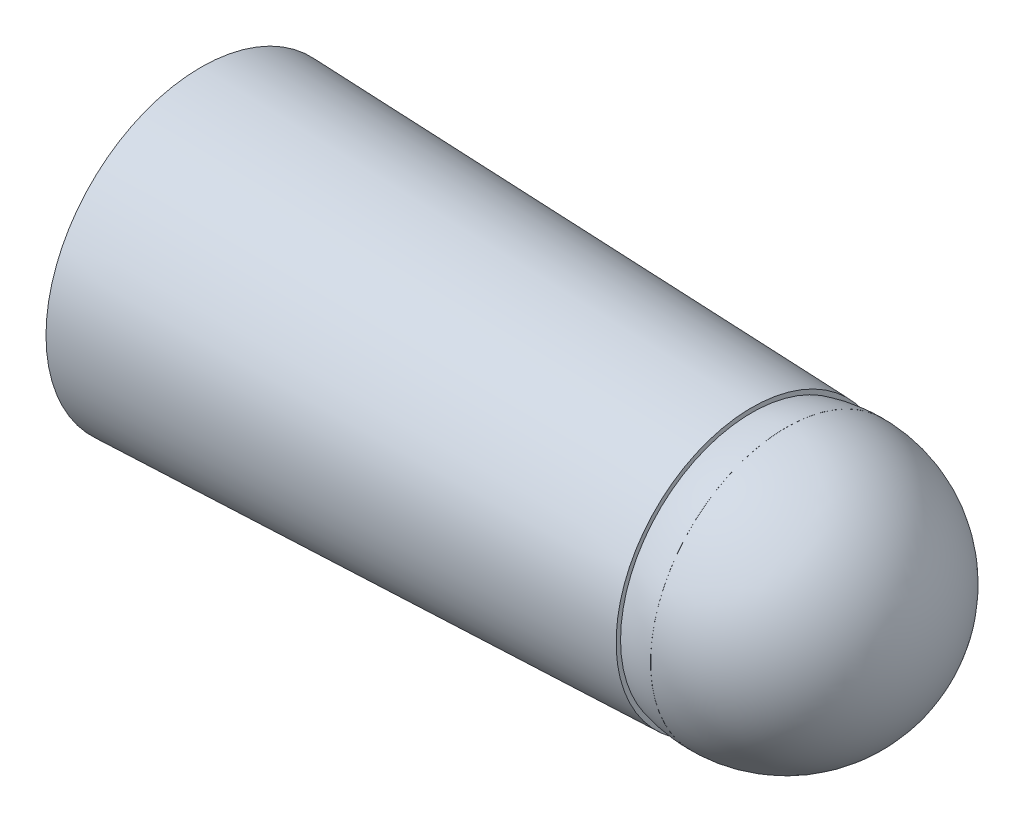
ISO-10303-21;
HEADER;
FILE_DESCRIPTION(('STEP AP214'),'2;1');
FILE_NAME('part.step','',(''),(''),'','','');
FILE_SCHEMA(('AUTOMOTIVE_DESIGN { 1 0 10303 214 1 1 1 1 }'));
ENDSEC;
DATA;
#1=APPLICATION_CONTEXT('core data for automotive mechanical design processes');
#2=APPLICATION_PROTOCOL_DEFINITION('international standard','automotive_design',2000,#1);
#3=PRODUCT_CONTEXT('',#1,'mechanical');
#4=PRODUCT('Part','Part','',(#3));
#5=PRODUCT_RELATED_PRODUCT_CATEGORY('part','',(#4));
#6=PRODUCT_DEFINITION_FORMATION('','',#4);
#7=PRODUCT_DEFINITION_CONTEXT('part definition',#1,'design');
#8=PRODUCT_DEFINITION('design','',#6,#7);
#9=PRODUCT_DEFINITION_SHAPE('','',#8);
#10=(LENGTH_UNIT() NAMED_UNIT(*) SI_UNIT(.MILLI.,.METRE.));
#11=(NAMED_UNIT(*) PLANE_ANGLE_UNIT() SI_UNIT($,.RADIAN.));
#12=(NAMED_UNIT(*) SI_UNIT($,.STERADIAN.) SOLID_ANGLE_UNIT());
#13=UNCERTAINTY_MEASURE_WITH_UNIT(LENGTH_MEASURE(1.E-05),#10,'distance_accuracy_value','');
#14=(GEOMETRIC_REPRESENTATION_CONTEXT(3) GLOBAL_UNCERTAINTY_ASSIGNED_CONTEXT((#13)) GLOBAL_UNIT_ASSIGNED_CONTEXT((#10,
#11,#12)) REPRESENTATION_CONTEXT('',''));
#15=CARTESIAN_POINT('',(0.,0.,0.));
#16=DIRECTION('',(0.,0.,1.));
#17=DIRECTION('',(1.,0.,0.));
#18=AXIS2_PLACEMENT_3D('',#15,#16,#17);
#19=CARTESIAN_POINT('',(8.5,0.,0.));
#20=DIRECTION('',(1.,0.,0.));
#21=DIRECTION('',(0.,0.,-1.));
#22=AXIS2_PLACEMENT_3D('',#19,#20,#21);
#23=PLANE('',#22);
#24=CARTESIAN_POINT('',(8.5,0.,0.));
#25=DIRECTION('',(1.,0.,0.));
#26=DIRECTION('',(0.,0.,-1.));
#27=AXIS2_PLACEMENT_3D('',#24,#25,#26);
#28=CIRCLE('',#27,1.97063384406602);
#29=CARTESIAN_POINT('',(8.5,0.,-1.97063384406602));
#30=VERTEX_POINT('',#29);
#31=EDGE_CURVE('E11',#30,#30,#28,.T.);
#32=ORIENTED_EDGE('',*,*,#31,.T.);
#33=EDGE_LOOP('',(#32));
#34=FACE_BOUND('',#33,.T.);
#35=ADVANCED_FACE('F42',(#34),#23,.T.);
#36=OPEN_SHELL('',(#35));
#37=SHELL_BASED_SURFACE_MODEL('B2',(#36));
#38=CARTESIAN_POINT('',(8.,0.,0.));
#39=DIRECTION('',(1.,0.,0.));
#40=DIRECTION('',(0.,0.,-1.));
#41=AXIS2_PLACEMENT_3D('',#38,#39,#40);
#42=PLANE('',#41);
#43=CARTESIAN_POINT('',(8.,0.,0.));
#44=DIRECTION('',(1.,0.,0.));
#45=DIRECTION('',(0.,0.,-1.));
#46=AXIS2_PLACEMENT_3D('',#43,#44,#45);
#47=CIRCLE('',#46,1.97063384406602);
#48=CARTESIAN_POINT('',(8.,0.,-1.97063384406602));
#49=VERTEX_POINT('',#48);
#50=EDGE_CURVE('E41',#49,#49,#47,.T.);
#51=ORIENTED_EDGE('',*,*,#50,.T.);
#52=EDGE_LOOP('',(#51));
#53=FACE_BOUND('',#52,.T.);
#54=CARTESIAN_POINT('',(8.,0.,0.));
#55=DIRECTION('',(1.,0.,0.));
#56=DIRECTION('',(0.,0.,-1.));
#57=AXIS2_PLACEMENT_3D('',#54,#55,#56);
#58=CIRCLE('',#57,1.90614735720469);
#59=CARTESIAN_POINT('',(8.,0.,-1.90614735720469));
#60=VERTEX_POINT('',#59);
#61=EDGE_CURVE('E62',#60,#60,#58,.F.);
#62=ORIENTED_EDGE('',*,*,#61,.T.);
#63=EDGE_LOOP('',(#62));
#64=FACE_BOUND('',#63,.T.);
#65=ADVANCED_FACE('F58',(#53,#64),#42,.T.);
#66=CARTESIAN_POINT('',(0.,0.,0.));
#67=DIRECTION('',(-1.,0.,0.));
#68=DIRECTION('',(0.,0.,-1.));
#69=AXIS2_PLACEMENT_3D('',#66,#67,#68);
#70=CONICAL_SURFACE('',#69,2.25,0.0349065850398866);
#71=ORIENTED_EDGE('',*,*,#50,.F.);
#72=EDGE_LOOP('',(#71));
#73=FACE_BOUND('',#72,.T.);
#74=CARTESIAN_POINT('',(0.,0.,0.));
#75=DIRECTION('',(1.,0.,0.));
#76=DIRECTION('',(0.,0.,-1.));
#77=AXIS2_PLACEMENT_3D('',#74,#75,#76);
#78=CIRCLE('',#77,2.25);
#79=CARTESIAN_POINT('',(0.,0.,-2.25));
#80=VERTEX_POINT('',#79);
#81=EDGE_CURVE('E66',#80,#80,#78,.T.);
#82=ORIENTED_EDGE('',*,*,#81,.T.);
#83=EDGE_LOOP('',(#82));
#84=FACE_BOUND('',#83,.T.);
#85=ADVANCED_FACE('F60',(#73,#84),#70,.T.);
#86=CARTESIAN_POINT('',(0.,0.,0.));
#87=DIRECTION('',(1.,0.,0.));
#88=DIRECTION('',(0.,0.,-1.));
#89=AXIS2_PLACEMENT_3D('',#86,#87,#88);
#90=PLANE('',#89);
#91=ORIENTED_EDGE('',*,*,#81,.F.);
#92=EDGE_LOOP('',(#91));
#93=FACE_BOUND('',#92,.T.);
#94=ADVANCED_FACE('F79',(#93),#90,.F.);
#95=CARTESIAN_POINT('',(8.5,0.,0.));
#96=DIRECTION('',(0.,1.,0.));
#97=DIRECTION('',(0.,0.,-1.));
#98=AXIS2_PLACEMENT_3D('',#95,#96,#97);
#99=SPHERICAL_SURFACE('',#98,1.97063384406602);
#100=CARTESIAN_POINT('',(8.5,0.,0.));
#101=DIRECTION('',(1.,0.,0.));
#102=DIRECTION('',(0.,0.,-1.));
#103=AXIS2_PLACEMENT_3D('',#100,#101,#102);
#104=SPHERICAL_SURFACE('',#103,1.97063384406602);
#105=ORIENTED_EDGE('',*,*,#61,.F.);
#106=EDGE_LOOP('',(#105));
#107=FACE_BOUND('',#106,.T.);
#108=ADVANCED_FACE('F77',(#107),#104,.T.);
#109=CLOSED_SHELL('',(#65,#85,#94,#108));
#110=MANIFOLD_SOLID_BREP('B6',#109);
#111=ADVANCED_BREP_SHAPE_REPRESENTATION('',(#18,#110),#14);
#112=MANIFOLD_SURFACE_SHAPE_REPRESENTATION('',(#18,#37),#14);
#113=SHAPE_REPRESENTATION('',(#18),#14);
#114=SHAPE_DEFINITION_REPRESENTATION(#9,#113);
#115=SHAPE_REPRESENTATION_RELATIONSHIP('','',#113,#111);
#116=SHAPE_REPRESENTATION_RELATIONSHIP('','',#113,#112);
ENDSEC;
END-ISO-10303-21;
